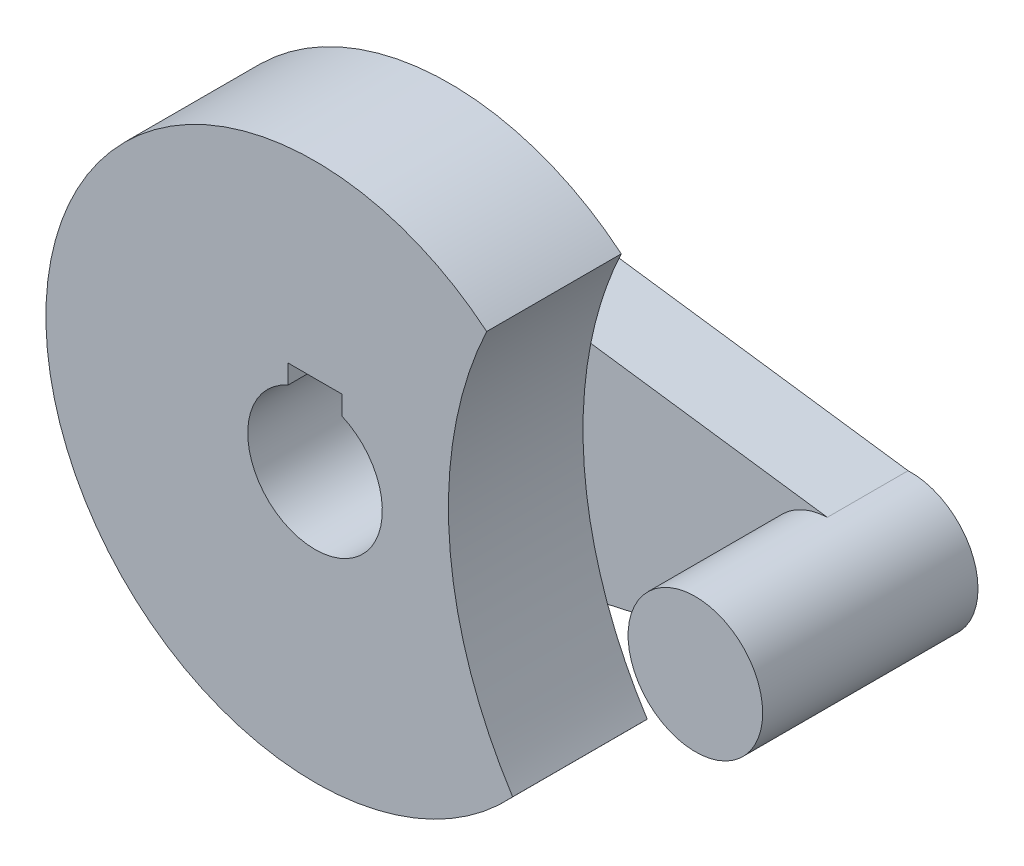
ISO-10303-21;
HEADER;
FILE_DESCRIPTION(('STEP AP214'),'2;1');
FILE_NAME('part.step','',(''),(''),'','','');
FILE_SCHEMA(('AUTOMOTIVE_DESIGN { 1 0 10303 214 1 1 1 1 }'));
ENDSEC;
DATA;
#1=APPLICATION_CONTEXT('core data for automotive mechanical design processes');
#2=APPLICATION_PROTOCOL_DEFINITION('international standard','automotive_design',2000,#1);
#3=PRODUCT_CONTEXT('',#1,'mechanical');
#4=PRODUCT('Part','Part','',(#3));
#5=PRODUCT_RELATED_PRODUCT_CATEGORY('part','',(#4));
#6=PRODUCT_DEFINITION_FORMATION('','',#4);
#7=PRODUCT_DEFINITION_CONTEXT('part definition',#1,'design');
#8=PRODUCT_DEFINITION('design','',#6,#7);
#9=PRODUCT_DEFINITION_SHAPE('','',#8);
#10=(LENGTH_UNIT() NAMED_UNIT(*) SI_UNIT(.MILLI.,.METRE.));
#11=(NAMED_UNIT(*) PLANE_ANGLE_UNIT() SI_UNIT($,.RADIAN.));
#12=(NAMED_UNIT(*) SI_UNIT($,.STERADIAN.) SOLID_ANGLE_UNIT());
#13=UNCERTAINTY_MEASURE_WITH_UNIT(LENGTH_MEASURE(1.E-05),#10,'distance_accuracy_value','');
#14=(GEOMETRIC_REPRESENTATION_CONTEXT(3) GLOBAL_UNCERTAINTY_ASSIGNED_CONTEXT((#13)) GLOBAL_UNIT_ASSIGNED_CONTEXT((#10,
#11,#12)) REPRESENTATION_CONTEXT('',''));
#15=CARTESIAN_POINT('',(0.,0.,0.));
#16=DIRECTION('',(0.,0.,1.));
#17=DIRECTION('',(1.,0.,0.));
#18=AXIS2_PLACEMENT_3D('',#15,#16,#17);
#19=CARTESIAN_POINT('',(0.,0.,0.));
#20=DIRECTION('',(0.,0.,1.));
#21=DIRECTION('',(1.,0.,0.));
#22=AXIS2_PLACEMENT_3D('',#19,#20,#21);
#23=PLANE('',#22);
#24=DIRECTION('',(0.990736497261268,-0.135798354167031,0.));
#25=VECTOR('',#24,1.);
#26=CARTESIAN_POINT('',(14.0335058789938,3.05134605448984,0.));
#27=LINE('',#26,#25);
#28=CARTESIAN_POINT('',(-0.163638990753575,4.99732151063999,0.));
#29=VERTEX_POINT('',#28);
#30=CARTESIAN_POINT('',(5.24421391432889,4.25607747035515,0.));
#31=VERTEX_POINT('',#30);
#32=EDGE_CURVE('E64',#29,#31,#27,.T.);
#33=ORIENTED_EDGE('',*,*,#32,.F.);
#34=CARTESIAN_POINT('',(0.,0.,0.));
#35=DIRECTION('',(0.,0.,-1.));
#36=DIRECTION('',(-1.,0.,0.));
#37=AXIS2_PLACEMENT_3D('',#34,#35,#36);
#38=CIRCLE('',#37,5.);
#39=CARTESIAN_POINT('',(1.0757331271312,-4.88290878874391,0.));
#40=VERTEX_POINT('',#39);
#41=EDGE_CURVE('E151',#40,#29,#38,.T.);
#42=ORIENTED_EDGE('',*,*,#41,.F.);
#43=DIRECTION('',(-0.976581757748783,-0.215146625426239,0.));
#44=VECTOR('',#43,1.);
#45=CARTESIAN_POINT('',(14.6691758975903,-1.8881945041655,0.));
#46=LINE('',#45,#44);
#47=CARTESIAN_POINT('',(5.86964475703573,-3.82678225189038,0.));
#48=VERTEX_POINT('',#47);
#49=EDGE_CURVE('E49',#48,#40,#46,.T.);
#50=ORIENTED_EDGE('',*,*,#49,.F.);
#51=CARTESIAN_POINT('',(19.9558087235121,1.32879576706565,0.));
#52=DIRECTION('',(0.,0.,-1.));
#53=DIRECTION('',(-1.,0.,0.));
#54=AXIS2_PLACEMENT_3D('',#51,#52,#53);
#55=CIRCLE('',#54,15.);
#56=CARTESIAN_POINT('',(7.34228461211551,-6.78902472190901,0.));
#57=VERTEX_POINT('',#56);
#58=EDGE_CURVE('E187',#57,#48,#55,.T.);
#59=ORIENTED_EDGE('',*,*,#58,.F.);
#60=CARTESIAN_POINT('',(0.,0.,0.));
#61=DIRECTION('',(0.,0.,1.));
#62=DIRECTION('',(1.,0.,0.));
#63=AXIS2_PLACEMENT_3D('',#60,#61,#62);
#64=CIRCLE('',#63,10.);
#65=CARTESIAN_POINT('',(6.37733388529864,7.70257181176662,0.));
#66=VERTEX_POINT('',#65);
#67=EDGE_CURVE('E193',#66,#57,#64,.T.);
#68=ORIENTED_EDGE('',*,*,#67,.F.);
#69=EDGE_CURVE('E182',#31,#66,#55,.T.);
#70=ORIENTED_EDGE('',*,*,#69,.F.);
#71=EDGE_LOOP('',(#33,#42,#50,#59,#68,#70));
#72=FACE_BOUND('',#71,.T.);
#73=ADVANCED_FACE('F41',(#72),#23,.F.);
#74=CARTESIAN_POINT('',(0.,0.,5.));
#75=DIRECTION('',(0.,0.,1.));
#76=DIRECTION('',(1.,0.,0.));
#77=AXIS2_PLACEMENT_3D('',#74,#75,#76);
#78=PLANE('',#77);
#79=DIRECTION('',(0.,1.,0.));
#80=VECTOR('',#79,1.);
#81=CARTESIAN_POINT('',(1.,3.,5.));
#82=LINE('',#81,#80);
#83=CARTESIAN_POINT('',(1.,2.29128784747792,5.));
#84=VERTEX_POINT('',#83);
#85=CARTESIAN_POINT('',(1.,3.,5.));
#86=VERTEX_POINT('',#85);
#87=EDGE_CURVE('E128',#84,#86,#82,.T.);
#88=ORIENTED_EDGE('',*,*,#87,.F.);
#89=CARTESIAN_POINT('',(0.,0.,5.));
#90=DIRECTION('',(0.,0.,1.));
#91=DIRECTION('',(1.,0.,0.));
#92=AXIS2_PLACEMENT_3D('',#89,#90,#91);
#93=CIRCLE('',#92,2.5);
#94=CARTESIAN_POINT('',(-1.,2.29128784747792,5.));
#95=VERTEX_POINT('',#94);
#96=EDGE_CURVE('E186',#95,#84,#93,.T.);
#97=ORIENTED_EDGE('',*,*,#96,.F.);
#98=DIRECTION('',(0.,-1.,0.));
#99=VECTOR('',#98,1.);
#100=CARTESIAN_POINT('',(-1.,3.,5.));
#101=LINE('',#100,#99);
#102=CARTESIAN_POINT('',(-1.,3.,5.));
#103=VERTEX_POINT('',#102);
#104=EDGE_CURVE('E138',#103,#95,#101,.T.);
#105=ORIENTED_EDGE('',*,*,#104,.F.);
#106=DIRECTION('',(-1.,0.,0.));
#107=VECTOR('',#106,1.);
#108=CARTESIAN_POINT('',(-1.,3.,5.));
#109=LINE('',#108,#107);
#110=EDGE_CURVE('E281',#86,#103,#109,.T.);
#111=ORIENTED_EDGE('',*,*,#110,.F.);
#112=EDGE_LOOP('',(#88,#97,#105,#111));
#113=FACE_BOUND('',#112,.T.);
#114=CARTESIAN_POINT('',(19.9558087235121,1.32879576706565,5.));
#115=DIRECTION('',(0.,0.,-1.));
#116=DIRECTION('',(-1.,0.,0.));
#117=AXIS2_PLACEMENT_3D('',#114,#115,#116);
#118=CIRCLE('',#117,15.);
#119=CARTESIAN_POINT('',(7.34228461211551,-6.78902472190901,5.));
#120=VERTEX_POINT('',#119);
#121=CARTESIAN_POINT('',(6.37733388529864,7.70257181176662,5.));
#122=VERTEX_POINT('',#121);
#123=EDGE_CURVE('E183',#120,#122,#118,.T.);
#124=ORIENTED_EDGE('',*,*,#123,.T.);
#125=CARTESIAN_POINT('',(0.,0.,5.));
#126=DIRECTION('',(0.,0.,1.));
#127=DIRECTION('',(1.,0.,0.));
#128=AXIS2_PLACEMENT_3D('',#125,#126,#127);
#129=CIRCLE('',#128,10.);
#130=EDGE_CURVE('E194',#122,#120,#129,.T.);
#131=ORIENTED_EDGE('',*,*,#130,.T.);
#132=EDGE_LOOP('',(#124,#131));
#133=FACE_BOUND('',#132,.T.);
#134=ADVANCED_FACE('F233',(#113,#133),#78,.T.);
#135=CARTESIAN_POINT('',(0.,0.,5.));
#136=DIRECTION('',(0.,0.,-1.));
#137=DIRECTION('',(-1.,0.,0.));
#138=AXIS2_PLACEMENT_3D('',#135,#136,#137);
#139=CYLINDRICAL_SURFACE('',#138,10.);
#140=ORIENTED_EDGE('',*,*,#67,.T.);
#141=DIRECTION('',(0.,0.,-1.));
#142=VECTOR('',#141,1.);
#143=CARTESIAN_POINT('',(7.34228461211552,-6.78902472190901,2.5));
#144=LINE('',#143,#142);
#145=EDGE_CURVE('E201',#57,#120,#144,.F.);
#146=ORIENTED_EDGE('',*,*,#145,.T.);
#147=ORIENTED_EDGE('',*,*,#130,.F.);
#148=DIRECTION('',(0.,0.,-1.));
#149=VECTOR('',#148,1.);
#150=CARTESIAN_POINT('',(6.37733388529864,7.70257181176662,2.5));
#151=LINE('',#150,#149);
#152=EDGE_CURVE('E197',#122,#66,#151,.T.);
#153=ORIENTED_EDGE('',*,*,#152,.T.);
#154=EDGE_LOOP('',(#140,#146,#147,#153));
#155=FACE_BOUND('',#154,.T.);
#156=ADVANCED_FACE('F43',(#155),#139,.T.);
#157=CARTESIAN_POINT('',(0.,0.,5.));
#158=DIRECTION('',(0.,0.,-1.));
#159=DIRECTION('',(-1.,0.,0.));
#160=AXIS2_PLACEMENT_3D('',#157,#158,#159);
#161=CYLINDRICAL_SURFACE('',#160,2.5);
#162=DIRECTION('',(0.,0.,-1.));
#163=VECTOR('',#162,1.);
#164=CARTESIAN_POINT('',(1.,2.29128784747792,5.));
#165=LINE('',#164,#163);
#166=CARTESIAN_POINT('',(1.,2.29128784747792,-3.));
#167=VERTEX_POINT('',#166);
#168=EDGE_CURVE('E225',#167,#84,#165,.F.);
#169=ORIENTED_EDGE('',*,*,#168,.F.);
#170=CARTESIAN_POINT('',(0.,0.,-3.));
#171=DIRECTION('',(0.,0.,-1.));
#172=DIRECTION('',(-1.,0.,0.));
#173=AXIS2_PLACEMENT_3D('',#170,#171,#172);
#174=CIRCLE('',#173,2.5);
#175=CARTESIAN_POINT('',(-1.,2.29128784747792,-3.));
#176=VERTEX_POINT('',#175);
#177=EDGE_CURVE('E144',#167,#176,#174,.T.);
#178=ORIENTED_EDGE('',*,*,#177,.T.);
#179=DIRECTION('',(0.,0.,-1.));
#180=VECTOR('',#179,1.);
#181=CARTESIAN_POINT('',(-1.,2.29128784747792,5.));
#182=LINE('',#181,#180);
#183=EDGE_CURVE('E273',#95,#176,#182,.T.);
#184=ORIENTED_EDGE('',*,*,#183,.F.);
#185=ORIENTED_EDGE('',*,*,#96,.T.);
#186=EDGE_LOOP('',(#169,#178,#184,#185));
#187=FACE_BOUND('',#186,.T.);
#188=ADVANCED_FACE('F242',(#187),#161,.F.);
#189=CARTESIAN_POINT('',(19.9558087235121,1.32879576706565,5.));
#190=DIRECTION('',(0.,0.,-1.));
#191=DIRECTION('',(-1.,0.,0.));
#192=AXIS2_PLACEMENT_3D('',#189,#190,#191);
#193=CYLINDRICAL_SURFACE('',#192,15.);
#194=ORIENTED_EDGE('',*,*,#58,.T.);
#195=EDGE_CURVE('E190',#48,#31,#55,.T.);
#196=ORIENTED_EDGE('',*,*,#195,.T.);
#197=ORIENTED_EDGE('',*,*,#69,.T.);
#198=ORIENTED_EDGE('',*,*,#152,.F.);
#199=ORIENTED_EDGE('',*,*,#123,.F.);
#200=ORIENTED_EDGE('',*,*,#145,.F.);
#201=EDGE_LOOP('',(#194,#196,#197,#198,#199,#200));
#202=FACE_BOUND('',#201,.T.);
#203=ADVANCED_FACE('F230',(#202),#193,.F.);
#204=CARTESIAN_POINT('',(14.1313093340247,0.553259890206461,-3.));
#205=DIRECTION('',(0.,0.,-1.));
#206=DIRECTION('',(-1.,0.,0.));
#207=AXIS2_PLACEMENT_3D('',#204,#205,#206);
#208=PLANE('',#207);
#209=DIRECTION('',(0.,-1.,0.));
#210=VECTOR('',#209,1.);
#211=CARTESIAN_POINT('',(0.999999999999999,0.553259890206458,-3.));
#212=LINE('',#211,#210);
#213=CARTESIAN_POINT('',(1.,3.,-3.));
#214=VERTEX_POINT('',#213);
#215=EDGE_CURVE('E11',#214,#167,#212,.T.);
#216=ORIENTED_EDGE('',*,*,#215,.F.);
#217=DIRECTION('',(-1.,0.,0.));
#218=VECTOR('',#217,1.);
#219=CARTESIAN_POINT('',(-1.,3.,-3.));
#220=LINE('',#219,#218);
#221=CARTESIAN_POINT('',(-1.,3.,-3.));
#222=VERTEX_POINT('',#221);
#223=EDGE_CURVE('E135',#214,#222,#220,.T.);
#224=ORIENTED_EDGE('',*,*,#223,.T.);
#225=DIRECTION('',(0.,-1.,0.));
#226=VECTOR('',#225,1.);
#227=CARTESIAN_POINT('',(-1.,3.,-3.));
#228=LINE('',#227,#226);
#229=EDGE_CURVE('E56',#222,#176,#228,.T.);
#230=ORIENTED_EDGE('',*,*,#229,.T.);
#231=ORIENTED_EDGE('',*,*,#177,.F.);
#232=EDGE_LOOP('',(#216,#224,#230,#231));
#233=FACE_BOUND('',#232,.T.);
#234=CARTESIAN_POINT('',(14.1313093340247,0.553259890206461,-3.));
#235=DIRECTION('',(0.,0.,-1.));
#236=DIRECTION('',(-1.,0.,0.));
#237=AXIS2_PLACEMENT_3D('',#234,#235,#236);
#238=CIRCLE('',#237,2.5);
#239=CARTESIAN_POINT('',(14.0335058789938,3.05134605448984,-3.));
#240=VERTEX_POINT('',#239);
#241=CARTESIAN_POINT('',(14.6691758975903,-1.8881945041655,-3.));
#242=VERTEX_POINT('',#241);
#243=EDGE_CURVE('E158',#240,#242,#238,.T.);
#244=ORIENTED_EDGE('',*,*,#243,.T.);
#245=DIRECTION('',(-0.976581757748783,-0.215146625426239,0.));
#246=VECTOR('',#245,1.);
#247=CARTESIAN_POINT('',(14.6691758975903,-1.8881945041655,-3.));
#248=LINE('',#247,#246);
#249=CARTESIAN_POINT('',(1.0757331271312,-4.88290878874391,-3.));
#250=VERTEX_POINT('',#249);
#251=EDGE_CURVE('E161',#242,#250,#248,.T.);
#252=ORIENTED_EDGE('',*,*,#251,.T.);
#253=CARTESIAN_POINT('',(0.,0.,-3.));
#254=DIRECTION('',(0.,0.,-1.));
#255=DIRECTION('',(-1.,0.,0.));
#256=AXIS2_PLACEMENT_3D('',#253,#254,#255);
#257=CIRCLE('',#256,5.);
#258=CARTESIAN_POINT('',(-0.163638990753575,4.99732151063999,-3.));
#259=VERTEX_POINT('',#258);
#260=EDGE_CURVE('E163',#250,#259,#257,.T.);
#261=ORIENTED_EDGE('',*,*,#260,.T.);
#262=DIRECTION('',(0.990736497261268,-0.135798354167031,0.));
#263=VECTOR('',#262,1.);
#264=CARTESIAN_POINT('',(14.0335058789938,3.05134605448984,-3.));
#265=LINE('',#264,#263);
#266=EDGE_CURVE('E165',#259,#240,#265,.T.);
#267=ORIENTED_EDGE('',*,*,#266,.T.);
#268=EDGE_LOOP('',(#244,#252,#261,#267));
#269=FACE_BOUND('',#268,.T.);
#270=ADVANCED_FACE('F141',(#233,#269),#208,.T.);
#271=CARTESIAN_POINT('',(14.1313093340247,0.553259890206461,0.));
#272=DIRECTION('',(0.,0.,-1.));
#273=DIRECTION('',(-1.,0.,0.));
#274=AXIS2_PLACEMENT_3D('',#271,#272,#273);
#275=PLANE('',#274);
#276=CARTESIAN_POINT('',(14.1313093340247,0.553259890206461,0.));
#277=DIRECTION('',(0.,0.,1.));
#278=DIRECTION('',(1.,0.,0.));
#279=AXIS2_PLACEMENT_3D('',#276,#277,#278);
#280=CIRCLE('',#279,2.5);
#281=CARTESIAN_POINT('',(14.0335058789938,3.05134605448984,0.));
#282=VERTEX_POINT('',#281);
#283=CARTESIAN_POINT('',(14.6691758975903,-1.8881945041655,0.));
#284=VERTEX_POINT('',#283);
#285=EDGE_CURVE('E154',#282,#284,#280,.T.);
#286=ORIENTED_EDGE('',*,*,#285,.F.);
#287=EDGE_CURVE('E169',#31,#282,#27,.T.);
#288=ORIENTED_EDGE('',*,*,#287,.F.);
#289=ORIENTED_EDGE('',*,*,#195,.F.);
#290=EDGE_CURVE('E147',#284,#48,#46,.T.);
#291=ORIENTED_EDGE('',*,*,#290,.F.);
#292=EDGE_LOOP('',(#286,#288,#289,#291));
#293=FACE_BOUND('',#292,.T.);
#294=ADVANCED_FACE('F227',(#293),#275,.F.);
#295=CARTESIAN_POINT('',(14.1313093340247,0.553259890206461,-3.));
#296=DIRECTION('',(0.,0.,1.));
#297=DIRECTION('',(1.,0.,0.));
#298=AXIS2_PLACEMENT_3D('',#295,#296,#297);
#299=CYLINDRICAL_SURFACE('',#298,2.5);
#300=DIRECTION('',(0.,0.,1.));
#301=VECTOR('',#300,1.);
#302=CARTESIAN_POINT('',(14.0335058789938,3.05134605448984,-3.));
#303=LINE('',#302,#301);
#304=EDGE_CURVE('E166',#240,#282,#303,.T.);
#305=ORIENTED_EDGE('',*,*,#304,.T.);
#306=ORIENTED_EDGE('',*,*,#285,.T.);
#307=DIRECTION('',(0.,0.,1.));
#308=VECTOR('',#307,1.);
#309=CARTESIAN_POINT('',(14.6691758975903,-1.8881945041655,-3.));
#310=LINE('',#309,#308);
#311=EDGE_CURVE('E179',#242,#284,#310,.T.);
#312=ORIENTED_EDGE('',*,*,#311,.F.);
#313=ORIENTED_EDGE('',*,*,#243,.F.);
#314=EDGE_LOOP('',(#305,#306,#312,#313));
#315=FACE_BOUND('',#314,.T.);
#316=CARTESIAN_POINT('',(14.1313093340247,0.553259890206461,5.));
#317=DIRECTION('',(0.,0.,1.));
#318=DIRECTION('',(1.,0.,0.));
#319=AXIS2_PLACEMENT_3D('',#316,#317,#318);
#320=CIRCLE('',#319,2.5);
#321=CARTESIAN_POINT('',(16.6313093340247,0.553259890206461,5.));
#322=VERTEX_POINT('',#321);
#323=EDGE_CURVE('E148',#322,#322,#320,.T.);
#324=ORIENTED_EDGE('',*,*,#323,.F.);
#325=EDGE_LOOP('',(#324));
#326=FACE_BOUND('',#325,.T.);
#327=ADVANCED_FACE('F220',(#315,#326),#299,.T.);
#328=CARTESIAN_POINT('',(14.6691758975903,-1.8881945041655,-3.));
#329=DIRECTION('',(-0.215146625426239,0.976581757748782,0.));
#330=DIRECTION('',(-0.976581757748783,-0.215146625426239,0.));
#331=AXIS2_PLACEMENT_3D('',#328,#329,#330);
#332=PLANE('',#331);
#333=ORIENTED_EDGE('',*,*,#290,.T.);
#334=ORIENTED_EDGE('',*,*,#49,.T.);
#335=DIRECTION('',(0.,0.,1.));
#336=VECTOR('',#335,1.);
#337=CARTESIAN_POINT('',(1.0757331271312,-4.88290878874391,-3.));
#338=LINE('',#337,#336);
#339=EDGE_CURVE('E176',#250,#40,#338,.T.);
#340=ORIENTED_EDGE('',*,*,#339,.F.);
#341=ORIENTED_EDGE('',*,*,#251,.F.);
#342=ORIENTED_EDGE('',*,*,#311,.T.);
#343=EDGE_LOOP('',(#333,#334,#340,#341,#342));
#344=FACE_BOUND('',#343,.T.);
#345=ADVANCED_FACE('F208',(#344),#332,.F.);
#346=CARTESIAN_POINT('',(0.,0.,-3.));
#347=DIRECTION('',(0.,0.,1.));
#348=DIRECTION('',(1.,0.,0.));
#349=AXIS2_PLACEMENT_3D('',#346,#347,#348);
#350=CYLINDRICAL_SURFACE('',#349,5.);
#351=ORIENTED_EDGE('',*,*,#41,.T.);
#352=DIRECTION('',(0.,0.,1.));
#353=VECTOR('',#352,1.);
#354=CARTESIAN_POINT('',(-0.163638990753575,4.99732151063999,-3.));
#355=LINE('',#354,#353);
#356=EDGE_CURVE('E173',#259,#29,#355,.T.);
#357=ORIENTED_EDGE('',*,*,#356,.F.);
#358=ORIENTED_EDGE('',*,*,#260,.F.);
#359=ORIENTED_EDGE('',*,*,#339,.T.);
#360=EDGE_LOOP('',(#351,#357,#358,#359));
#361=FACE_BOUND('',#360,.T.);
#362=ADVANCED_FACE('F213',(#361),#350,.T.);
#363=CARTESIAN_POINT('',(14.0335058789938,3.05134605448984,-3.));
#364=DIRECTION('',(-0.135798354167031,-0.990736497261267,0.));
#365=DIRECTION('',(0.990736497261268,-0.135798354167031,0.));
#366=AXIS2_PLACEMENT_3D('',#363,#364,#365);
#367=PLANE('',#366);
#368=ORIENTED_EDGE('',*,*,#32,.T.);
#369=ORIENTED_EDGE('',*,*,#287,.T.);
#370=ORIENTED_EDGE('',*,*,#304,.F.);
#371=ORIENTED_EDGE('',*,*,#266,.F.);
#372=ORIENTED_EDGE('',*,*,#356,.T.);
#373=EDGE_LOOP('',(#368,#369,#370,#371,#372));
#374=FACE_BOUND('',#373,.T.);
#375=ADVANCED_FACE('F254',(#374),#367,.F.);
#376=CARTESIAN_POINT('',(14.1313093340247,0.553259890206461,5.));
#377=DIRECTION('',(0.,0.,1.));
#378=DIRECTION('',(1.,0.,0.));
#379=AXIS2_PLACEMENT_3D('',#376,#377,#378);
#380=PLANE('',#379);
#381=ORIENTED_EDGE('',*,*,#323,.T.);
#382=EDGE_LOOP('',(#381));
#383=FACE_BOUND('',#382,.T.);
#384=ADVANCED_FACE('F257',(#383),#380,.T.);
#385=CARTESIAN_POINT('',(1.,3.,-3.));
#386=DIRECTION('',(1.,0.,0.));
#387=DIRECTION('',(0.,1.,0.));
#388=AXIS2_PLACEMENT_3D('',#385,#386,#387);
#389=PLANE('',#388);
#390=ORIENTED_EDGE('',*,*,#168,.T.);
#391=ORIENTED_EDGE('',*,*,#87,.T.);
#392=DIRECTION('',(0.,0.,1.));
#393=VECTOR('',#392,1.);
#394=CARTESIAN_POINT('',(1.,3.,-3.));
#395=LINE('',#394,#393);
#396=EDGE_CURVE('E122',#214,#86,#395,.T.);
#397=ORIENTED_EDGE('',*,*,#396,.F.);
#398=ORIENTED_EDGE('',*,*,#215,.T.);
#399=EDGE_LOOP('',(#390,#391,#397,#398));
#400=FACE_BOUND('',#399,.T.);
#401=ADVANCED_FACE('F124',(#400),#389,.F.);
#402=CARTESIAN_POINT('',(-1.,3.,-3.));
#403=DIRECTION('',(-1.,0.,0.));
#404=DIRECTION('',(0.,-1.,0.));
#405=AXIS2_PLACEMENT_3D('',#402,#403,#404);
#406=PLANE('',#405);
#407=ORIENTED_EDGE('',*,*,#183,.T.);
#408=ORIENTED_EDGE('',*,*,#229,.F.);
#409=DIRECTION('',(0.,0.,1.));
#410=VECTOR('',#409,1.);
#411=CARTESIAN_POINT('',(-1.,3.,-3.));
#412=LINE('',#411,#410);
#413=EDGE_CURVE('E132',#222,#103,#412,.T.);
#414=ORIENTED_EDGE('',*,*,#413,.T.);
#415=ORIENTED_EDGE('',*,*,#104,.T.);
#416=EDGE_LOOP('',(#407,#408,#414,#415));
#417=FACE_BOUND('',#416,.T.);
#418=ADVANCED_FACE('F267',(#417),#406,.F.);
#419=CARTESIAN_POINT('',(-1.,3.,-3.));
#420=DIRECTION('',(0.,1.,0.));
#421=DIRECTION('',(0.,0.,1.));
#422=AXIS2_PLACEMENT_3D('',#419,#420,#421);
#423=PLANE('',#422);
#424=ORIENTED_EDGE('',*,*,#110,.T.);
#425=ORIENTED_EDGE('',*,*,#413,.F.);
#426=ORIENTED_EDGE('',*,*,#223,.F.);
#427=ORIENTED_EDGE('',*,*,#396,.T.);
#428=EDGE_LOOP('',(#424,#425,#426,#427));
#429=FACE_BOUND('',#428,.T.);
#430=ADVANCED_FACE('F136',(#429),#423,.F.);
#431=CLOSED_SHELL('',(#73,#134,#156,#188,#203,#270,#294,#327,#345,#362,#375,#384,#401,#418,#430));
#432=MANIFOLD_SOLID_BREP('B2',#431);
#433=ADVANCED_BREP_SHAPE_REPRESENTATION('',(#18,#432),#14);
#434=SHAPE_DEFINITION_REPRESENTATION(#9,#433);
ENDSEC;
END-ISO-10303-21;
